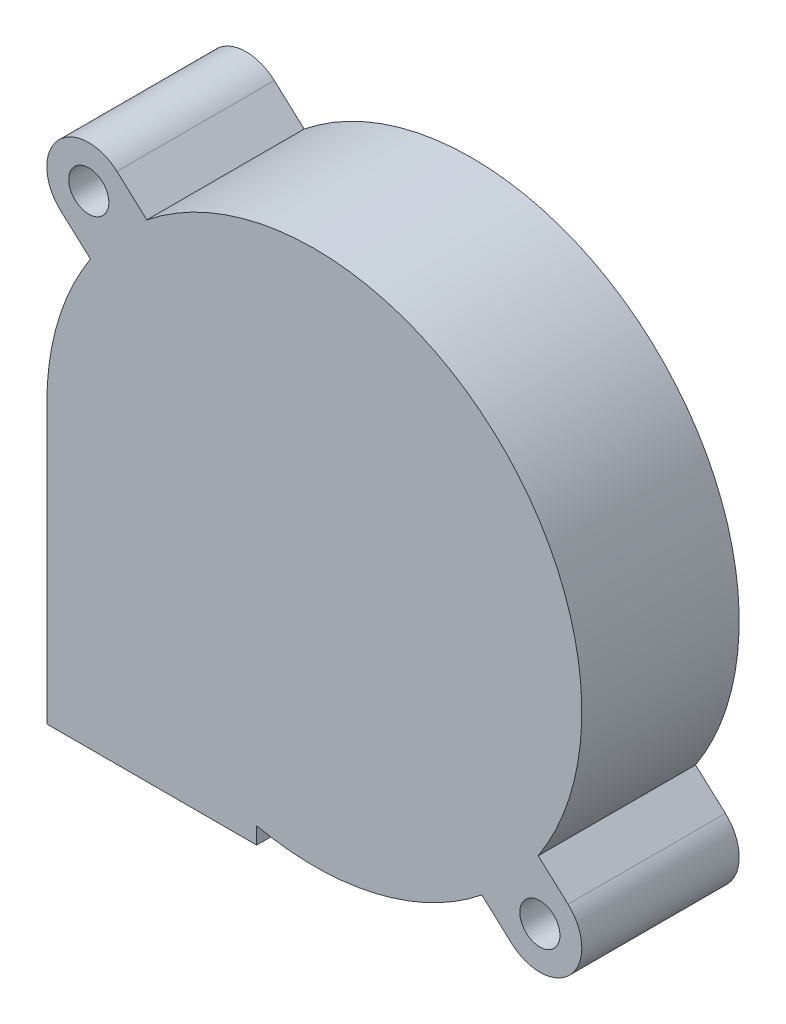
ISO-10303-21;
HEADER;
FILE_DESCRIPTION(('STEP AP214'),'2;1');
FILE_NAME('part.step','',(''),(''),'','','');
FILE_SCHEMA(('AUTOMOTIVE_DESIGN { 1 0 10303 214 1 1 1 1 }'));
ENDSEC;
DATA;
#1=APPLICATION_CONTEXT('core data for automotive mechanical design processes');
#2=APPLICATION_PROTOCOL_DEFINITION('international standard','automotive_design',2000,#1);
#3=PRODUCT_CONTEXT('',#1,'mechanical');
#4=PRODUCT('Part','Part','',(#3));
#5=PRODUCT_RELATED_PRODUCT_CATEGORY('part','',(#4));
#6=PRODUCT_DEFINITION_FORMATION('','',#4);
#7=PRODUCT_DEFINITION_CONTEXT('part definition',#1,'design');
#8=PRODUCT_DEFINITION('design','',#6,#7);
#9=PRODUCT_DEFINITION_SHAPE('','',#8);
#10=(LENGTH_UNIT() NAMED_UNIT(*) SI_UNIT(.MILLI.,.METRE.));
#11=(NAMED_UNIT(*) PLANE_ANGLE_UNIT() SI_UNIT($,.RADIAN.));
#12=(NAMED_UNIT(*) SI_UNIT($,.STERADIAN.) SOLID_ANGLE_UNIT());
#13=UNCERTAINTY_MEASURE_WITH_UNIT(LENGTH_MEASURE(1.E-05),#10,'distance_accuracy_value','');
#14=(GEOMETRIC_REPRESENTATION_CONTEXT(3) GLOBAL_UNCERTAINTY_ASSIGNED_CONTEXT((#13)) GLOBAL_UNIT_ASSIGNED_CONTEXT((#10,
#11,#12)) REPRESENTATION_CONTEXT('',''));
#15=CARTESIAN_POINT('',(0.,0.,0.));
#16=DIRECTION('',(0.,0.,1.));
#17=DIRECTION('',(1.,0.,0.));
#18=AXIS2_PLACEMENT_3D('',#15,#16,#17);
#19=CARTESIAN_POINT('',(27.3834021871777,30.1919562576574,15.));
#20=DIRECTION('',(0.671814938485816,0.740719034740771,0.));
#21=DIRECTION('',(-0.740719034740771,0.671814938485816,0.));
#22=AXIS2_PLACEMENT_3D('',#19,#20,#21);
#23=PLANE('',#22);
#24=DIRECTION('',(0.740719034740771,-0.671814938485816,0.));
#25=VECTOR('',#24,1.);
#26=CARTESIAN_POINT('',(27.3834021871777,30.1919562576574,0.));
#27=LINE('',#26,#25);
#28=CARTESIAN_POINT('',(6.68725975394327,48.9628761389631,0.));
#29=VERTEX_POINT('',#28);
#30=CARTESIAN_POINT('',(9.53275416856217,46.3820788791924,0.));
#31=VERTEX_POINT('',#30);
#32=EDGE_CURVE('E160',#29,#31,#27,.T.);
#33=ORIENTED_EDGE('',*,*,#32,.F.);
#34=DIRECTION('',(0.,0.,-1.));
#35=VECTOR('',#34,1.);
#36=CARTESIAN_POINT('',(6.68725975394327,48.9628761389631,15.));
#37=LINE('',#36,#35);
#38=CARTESIAN_POINT('',(6.68725975394327,48.9628761389631,15.));
#39=VERTEX_POINT('',#38);
#40=EDGE_CURVE('E11',#39,#29,#37,.T.);
#41=ORIENTED_EDGE('',*,*,#40,.F.);
#42=DIRECTION('',(0.740719034740771,-0.671814938485816,0.));
#43=VECTOR('',#42,1.);
#44=CARTESIAN_POINT('',(27.3834021871777,30.1919562576574,15.));
#45=LINE('',#44,#43);
#46=CARTESIAN_POINT('',(9.53275416856217,46.3820788791924,15.));
#47=VERTEX_POINT('',#46);
#48=EDGE_CURVE('E191',#39,#47,#45,.T.);
#49=ORIENTED_EDGE('',*,*,#48,.T.);
#50=DIRECTION('',(0.,0.,-1.));
#51=VECTOR('',#50,1.);
#52=CARTESIAN_POINT('',(9.53275416856217,46.3820788791924,15.));
#53=LINE('',#52,#51);
#54=EDGE_CURVE('E97',#47,#31,#53,.T.);
#55=ORIENTED_EDGE('',*,*,#54,.T.);
#56=EDGE_LOOP('',(#33,#41,#49,#55));
#57=FACE_BOUND('',#56,.T.);
#58=ADVANCED_FACE('F35',(#57),#23,.T.);
#59=CARTESIAN_POINT('',(4.,46.,15.));
#60=DIRECTION('',(0.,0.,-1.));
#61=DIRECTION('',(-1.,0.,0.));
#62=AXIS2_PLACEMENT_3D('',#59,#60,#61);
#63=CYLINDRICAL_SURFACE('',#62,4.);
#64=CARTESIAN_POINT('',(4.,46.,0.));
#65=DIRECTION('',(0.,0.,1.));
#66=DIRECTION('',(1.,0.,0.));
#67=AXIS2_PLACEMENT_3D('',#64,#65,#66);
#68=CIRCLE('',#67,4.);
#69=CARTESIAN_POINT('',(1.31274024605674,43.0371238610369,0.));
#70=VERTEX_POINT('',#69);
#71=EDGE_CURVE('E163',#29,#70,#68,.T.);
#72=ORIENTED_EDGE('',*,*,#71,.T.);
#73=DIRECTION('',(0.,0.,-1.));
#74=VECTOR('',#73,1.);
#75=CARTESIAN_POINT('',(1.31274024605674,43.0371238610369,15.));
#76=LINE('',#75,#74);
#77=CARTESIAN_POINT('',(1.31274024605674,43.0371238610369,15.));
#78=VERTEX_POINT('',#77);
#79=EDGE_CURVE('E43',#78,#70,#76,.T.);
#80=ORIENTED_EDGE('',*,*,#79,.F.);
#81=CARTESIAN_POINT('',(4.,46.,15.));
#82=DIRECTION('',(0.,0.,1.));
#83=DIRECTION('',(1.,0.,0.));
#84=AXIS2_PLACEMENT_3D('',#81,#82,#83);
#85=CIRCLE('',#84,4.);
#86=EDGE_CURVE('E238',#39,#78,#85,.T.);
#87=ORIENTED_EDGE('',*,*,#86,.F.);
#88=ORIENTED_EDGE('',*,*,#40,.T.);
#89=EDGE_LOOP('',(#72,#80,#87,#88));
#90=FACE_BOUND('',#89,.T.);
#91=ADVANCED_FACE('F263',(#90),#63,.T.);
#92=CARTESIAN_POINT('',(22.0088826792912,24.2662039797313,15.));
#93=DIRECTION('',(0.671814938485816,0.740719034740771,0.));
#94=DIRECTION('',(-0.740719034740771,0.671814938485816,0.));
#95=AXIS2_PLACEMENT_3D('',#92,#93,#94);
#96=PLANE('',#95);
#97=DIRECTION('',(0.740719034740771,-0.671814938485816,0.));
#98=VECTOR('',#97,1.);
#99=CARTESIAN_POINT('',(22.0088826792912,24.2662039797313,0.));
#100=LINE('',#99,#98);
#101=CARTESIAN_POINT('',(4.15823466067565,40.4563266012663,0.));
#102=VERTEX_POINT('',#101);
#103=EDGE_CURVE('E165',#70,#102,#100,.T.);
#104=ORIENTED_EDGE('',*,*,#103,.T.);
#105=DIRECTION('',(0.,0.,-1.));
#106=VECTOR('',#105,1.);
#107=CARTESIAN_POINT('',(4.15823466067565,40.4563266012663,15.));
#108=LINE('',#107,#106);
#109=CARTESIAN_POINT('',(4.15823466067565,40.4563266012663,15.));
#110=VERTEX_POINT('',#109);
#111=EDGE_CURVE('E208',#110,#102,#108,.T.);
#112=ORIENTED_EDGE('',*,*,#111,.F.);
#113=DIRECTION('',(0.740719034740771,-0.671814938485816,0.));
#114=VECTOR('',#113,1.);
#115=CARTESIAN_POINT('',(22.0088826792912,24.2662039797313,15.));
#116=LINE('',#115,#114);
#117=EDGE_CURVE('E217',#78,#110,#116,.T.);
#118=ORIENTED_EDGE('',*,*,#117,.F.);
#119=ORIENTED_EDGE('',*,*,#79,.T.);
#120=EDGE_LOOP('',(#104,#112,#118,#119));
#121=FACE_BOUND('',#120,.T.);
#122=ADVANCED_FACE('F215',(#121),#96,.F.);
#123=CARTESIAN_POINT('',(25.5,26.5,15.));
#124=DIRECTION('',(0.,0.,-1.));
#125=DIRECTION('',(-1.,0.,0.));
#126=AXIS2_PLACEMENT_3D('',#123,#124,#125);
#127=CYLINDRICAL_SURFACE('',#126,25.5);
#128=CARTESIAN_POINT('',(25.5,26.5,0.));
#129=DIRECTION('',(0.,0.,1.));
#130=DIRECTION('',(1.,0.,0.));
#131=AXIS2_PLACEMENT_3D('',#128,#129,#130);
#132=CIRCLE('',#131,25.5);
#133=CARTESIAN_POINT('',(0.,26.5,0.));
#134=VERTEX_POINT('',#133);
#135=EDGE_CURVE('E167',#102,#134,#132,.T.);
#136=ORIENTED_EDGE('',*,*,#135,.T.);
#137=DIRECTION('',(0.,0.,-1.));
#138=VECTOR('',#137,1.);
#139=CARTESIAN_POINT('',(0.,26.5,15.));
#140=LINE('',#139,#138);
#141=CARTESIAN_POINT('',(0.,26.5,15.));
#142=VERTEX_POINT('',#141);
#143=EDGE_CURVE('E206',#142,#134,#140,.T.);
#144=ORIENTED_EDGE('',*,*,#143,.F.);
#145=CARTESIAN_POINT('',(25.5,26.5,15.));
#146=DIRECTION('',(0.,0.,1.));
#147=DIRECTION('',(1.,0.,0.));
#148=AXIS2_PLACEMENT_3D('',#145,#146,#147);
#149=CIRCLE('',#148,25.5);
#150=EDGE_CURVE('E231',#110,#142,#149,.T.);
#151=ORIENTED_EDGE('',*,*,#150,.F.);
#152=ORIENTED_EDGE('',*,*,#111,.T.);
#153=EDGE_LOOP('',(#136,#144,#151,#152));
#154=FACE_BOUND('',#153,.T.);
#155=ADVANCED_FACE('F228',(#154),#127,.T.);
#156=CARTESIAN_POINT('',(0.,0.,15.));
#157=DIRECTION('',(-1.,0.,0.));
#158=DIRECTION('',(0.,0.,1.));
#159=AXIS2_PLACEMENT_3D('',#156,#157,#158);
#160=PLANE('',#159);
#161=DIRECTION('',(0.,1.,0.));
#162=VECTOR('',#161,1.);
#163=CARTESIAN_POINT('',(0.,0.,0.));
#164=LINE('',#163,#162);
#165=CARTESIAN_POINT('',(0.,0.,0.));
#166=VERTEX_POINT('',#165);
#167=EDGE_CURVE('E170',#166,#134,#164,.T.);
#168=ORIENTED_EDGE('',*,*,#167,.F.);
#169=DIRECTION('',(0.,0.,-1.));
#170=VECTOR('',#169,1.);
#171=CARTESIAN_POINT('',(0.,0.,15.));
#172=LINE('',#171,#170);
#173=CARTESIAN_POINT('',(0.,0.,15.));
#174=VERTEX_POINT('',#173);
#175=EDGE_CURVE('E204',#174,#166,#172,.T.);
#176=ORIENTED_EDGE('',*,*,#175,.F.);
#177=DIRECTION('',(0.,1.,0.));
#178=VECTOR('',#177,1.);
#179=CARTESIAN_POINT('',(0.,0.,15.));
#180=LINE('',#179,#178);
#181=EDGE_CURVE('E233',#174,#142,#180,.T.);
#182=ORIENTED_EDGE('',*,*,#181,.T.);
#183=ORIENTED_EDGE('',*,*,#143,.T.);
#184=EDGE_LOOP('',(#168,#176,#182,#183));
#185=FACE_BOUND('',#184,.T.);
#186=ADVANCED_FACE('F271',(#185),#160,.T.);
#187=CARTESIAN_POINT('',(0.,0.,15.));
#188=DIRECTION('',(0.,1.,0.));
#189=DIRECTION('',(0.,0.,1.));
#190=AXIS2_PLACEMENT_3D('',#187,#188,#189);
#191=PLANE('',#190);
#192=DIRECTION('',(1.,0.,0.));
#193=VECTOR('',#192,1.);
#194=CARTESIAN_POINT('',(0.,0.,0.));
#195=LINE('',#194,#193);
#196=CARTESIAN_POINT('',(20.,0.,0.));
#197=VERTEX_POINT('',#196);
#198=EDGE_CURVE('E174',#166,#197,#195,.T.);
#199=ORIENTED_EDGE('',*,*,#198,.T.);
#200=DIRECTION('',(0.,0.,-1.));
#201=VECTOR('',#200,1.);
#202=CARTESIAN_POINT('',(20.,0.,15.));
#203=LINE('',#202,#201);
#204=CARTESIAN_POINT('',(20.,0.,15.));
#205=VERTEX_POINT('',#204);
#206=EDGE_CURVE('E201',#205,#197,#203,.T.);
#207=ORIENTED_EDGE('',*,*,#206,.F.);
#208=DIRECTION('',(1.,0.,0.));
#209=VECTOR('',#208,1.);
#210=CARTESIAN_POINT('',(0.,0.,15.));
#211=LINE('',#210,#209);
#212=EDGE_CURVE('E236',#174,#205,#211,.T.);
#213=ORIENTED_EDGE('',*,*,#212,.F.);
#214=ORIENTED_EDGE('',*,*,#175,.T.);
#215=EDGE_LOOP('',(#199,#207,#213,#214));
#216=FACE_BOUND('',#215,.T.);
#217=ADVANCED_FACE('F250',(#216),#191,.F.);
#218=CARTESIAN_POINT('',(20.,0.,15.));
#219=DIRECTION('',(-1.,0.,0.));
#220=DIRECTION('',(0.,0.,1.));
#221=AXIS2_PLACEMENT_3D('',#218,#219,#220);
#222=PLANE('',#221);
#223=DIRECTION('',(0.,1.,0.));
#224=VECTOR('',#223,1.);
#225=CARTESIAN_POINT('',(20.,0.,0.));
#226=LINE('',#225,#224);
#227=CARTESIAN_POINT('',(20.,1.60020080402254,0.));
#228=VERTEX_POINT('',#227);
#229=EDGE_CURVE('E176',#197,#228,#226,.T.);
#230=ORIENTED_EDGE('',*,*,#229,.T.);
#231=DIRECTION('',(0.,0.,-1.));
#232=VECTOR('',#231,1.);
#233=CARTESIAN_POINT('',(20.,1.60020080402254,15.));
#234=LINE('',#233,#232);
#235=CARTESIAN_POINT('',(20.,1.60020080402254,15.));
#236=VERTEX_POINT('',#235);
#237=EDGE_CURVE('E198',#236,#228,#234,.T.);
#238=ORIENTED_EDGE('',*,*,#237,.F.);
#239=DIRECTION('',(0.,1.,0.));
#240=VECTOR('',#239,1.);
#241=CARTESIAN_POINT('',(20.,0.,15.));
#242=LINE('',#241,#240);
#243=EDGE_CURVE('E240',#205,#236,#242,.T.);
#244=ORIENTED_EDGE('',*,*,#243,.F.);
#245=ORIENTED_EDGE('',*,*,#206,.T.);
#246=EDGE_LOOP('',(#230,#238,#244,#245));
#247=FACE_BOUND('',#246,.T.);
#248=ADVANCED_FACE('F253',(#247),#222,.F.);
#249=CARTESIAN_POINT('',(41.4672458314378,6.61792112080755,0.));
#250=VERTEX_POINT('',#249);
#251=EDGE_CURVE('E171',#228,#250,#132,.T.);
#252=ORIENTED_EDGE('',*,*,#251,.T.);
#253=DIRECTION('',(0.,0.,-1.));
#254=VECTOR('',#253,1.);
#255=CARTESIAN_POINT('',(41.4672458314378,6.61792112080755,15.));
#256=LINE('',#255,#254);
#257=CARTESIAN_POINT('',(41.4672458314378,6.61792112080755,15.));
#258=VERTEX_POINT('',#257);
#259=EDGE_CURVE('E195',#258,#250,#256,.T.);
#260=ORIENTED_EDGE('',*,*,#259,.F.);
#261=EDGE_CURVE('E235',#236,#258,#149,.T.);
#262=ORIENTED_EDGE('',*,*,#261,.F.);
#263=ORIENTED_EDGE('',*,*,#237,.T.);
#264=EDGE_LOOP('',(#252,#260,#262,#263));
#265=FACE_BOUND('',#264,.T.);
#266=ADVANCED_FACE('F256',(#265),#127,.T.);
#267=CARTESIAN_POINT('',(22.0088826792912,24.2662039797313,15.));
#268=DIRECTION('',(0.671814938485816,0.740719034740771,0.));
#269=DIRECTION('',(-0.740719034740771,0.671814938485816,0.));
#270=AXIS2_PLACEMENT_3D('',#267,#268,#269);
#271=PLANE('',#270);
#272=DIRECTION('',(0.740719034740771,-0.671814938485816,0.));
#273=VECTOR('',#272,1.);
#274=CARTESIAN_POINT('',(22.0088826792912,24.2662039797313,0.));
#275=LINE('',#274,#273);
#276=CARTESIAN_POINT('',(44.3127402460567,4.03712386103691,0.));
#277=VERTEX_POINT('',#276);
#278=EDGE_CURVE('E178',#250,#277,#275,.T.);
#279=ORIENTED_EDGE('',*,*,#278,.T.);
#280=DIRECTION('',(0.,0.,-1.));
#281=VECTOR('',#280,1.);
#282=CARTESIAN_POINT('',(44.3127402460567,4.03712386103691,15.));
#283=LINE('',#282,#281);
#284=CARTESIAN_POINT('',(44.3127402460567,4.03712386103691,15.));
#285=VERTEX_POINT('',#284);
#286=EDGE_CURVE('E147',#285,#277,#283,.T.);
#287=ORIENTED_EDGE('',*,*,#286,.F.);
#288=DIRECTION('',(0.740719034740771,-0.671814938485816,0.));
#289=VECTOR('',#288,1.);
#290=CARTESIAN_POINT('',(22.0088826792912,24.2662039797313,15.));
#291=LINE('',#290,#289);
#292=EDGE_CURVE('E134',#258,#285,#291,.T.);
#293=ORIENTED_EDGE('',*,*,#292,.F.);
#294=ORIENTED_EDGE('',*,*,#259,.T.);
#295=EDGE_LOOP('',(#279,#287,#293,#294));
#296=FACE_BOUND('',#295,.T.);
#297=ADVANCED_FACE('F259',(#296),#271,.F.);
#298=CARTESIAN_POINT('',(47.,7.,15.));
#299=DIRECTION('',(0.,0.,-1.));
#300=DIRECTION('',(-1.,0.,0.));
#301=AXIS2_PLACEMENT_3D('',#298,#299,#300);
#302=CYLINDRICAL_SURFACE('',#301,4.00000000000001);
#303=CARTESIAN_POINT('',(47.,7.,0.));
#304=DIRECTION('',(0.,0.,1.));
#305=DIRECTION('',(1.,0.,0.));
#306=AXIS2_PLACEMENT_3D('',#303,#304,#305);
#307=CIRCLE('',#306,4.00000000000001);
#308=CARTESIAN_POINT('',(49.6872597539433,9.96287613896308,0.));
#309=VERTEX_POINT('',#308);
#310=EDGE_CURVE('E143',#277,#309,#307,.T.);
#311=ORIENTED_EDGE('',*,*,#310,.T.);
#312=DIRECTION('',(0.,0.,-1.));
#313=VECTOR('',#312,1.);
#314=CARTESIAN_POINT('',(49.6872597539433,9.96287613896308,15.));
#315=LINE('',#314,#313);
#316=CARTESIAN_POINT('',(49.6872597539433,9.96287613896308,15.));
#317=VERTEX_POINT('',#316);
#318=EDGE_CURVE('E140',#317,#309,#315,.T.);
#319=ORIENTED_EDGE('',*,*,#318,.F.);
#320=CARTESIAN_POINT('',(47.,7.,15.));
#321=DIRECTION('',(0.,0.,1.));
#322=DIRECTION('',(1.,0.,0.));
#323=AXIS2_PLACEMENT_3D('',#320,#321,#322);
#324=CIRCLE('',#323,4.00000000000001);
#325=EDGE_CURVE('E127',#285,#317,#324,.T.);
#326=ORIENTED_EDGE('',*,*,#325,.F.);
#327=ORIENTED_EDGE('',*,*,#286,.T.);
#328=EDGE_LOOP('',(#311,#319,#326,#327));
#329=FACE_BOUND('',#328,.T.);
#330=ADVANCED_FACE('F141',(#329),#302,.T.);
#331=CARTESIAN_POINT('',(27.3834021871777,30.1919562576574,15.));
#332=DIRECTION('',(0.671814938485816,0.740719034740771,0.));
#333=DIRECTION('',(-0.740719034740771,0.671814938485816,0.));
#334=AXIS2_PLACEMENT_3D('',#331,#332,#333);
#335=PLANE('',#334);
#336=DIRECTION('',(0.740719034740771,-0.671814938485816,0.));
#337=VECTOR('',#336,1.);
#338=CARTESIAN_POINT('',(27.3834021871777,30.1919562576574,0.));
#339=LINE('',#338,#337);
#340=CARTESIAN_POINT('',(46.8417653393244,12.5436733987337,0.));
#341=VERTEX_POINT('',#340);
#342=EDGE_CURVE('E181',#341,#309,#339,.T.);
#343=ORIENTED_EDGE('',*,*,#342,.F.);
#344=DIRECTION('',(0.,0.,-1.));
#345=VECTOR('',#344,1.);
#346=CARTESIAN_POINT('',(46.8417653393244,12.5436733987337,15.));
#347=LINE('',#346,#345);
#348=CARTESIAN_POINT('',(46.8417653393244,12.5436733987337,15.));
#349=VERTEX_POINT('',#348);
#350=EDGE_CURVE('E90',#349,#341,#347,.T.);
#351=ORIENTED_EDGE('',*,*,#350,.F.);
#352=DIRECTION('',(0.740719034740771,-0.671814938485816,0.));
#353=VECTOR('',#352,1.);
#354=CARTESIAN_POINT('',(27.3834021871777,30.1919562576574,15.));
#355=LINE('',#354,#353);
#356=EDGE_CURVE('E132',#349,#317,#355,.T.);
#357=ORIENTED_EDGE('',*,*,#356,.T.);
#358=ORIENTED_EDGE('',*,*,#318,.T.);
#359=EDGE_LOOP('',(#343,#351,#357,#358));
#360=FACE_BOUND('',#359,.T.);
#361=ADVANCED_FACE('F149',(#360),#335,.T.);
#362=CARTESIAN_POINT('',(47.,7.,15.));
#363=DIRECTION('',(0.,0.,-1.));
#364=DIRECTION('',(-1.,0.,0.));
#365=AXIS2_PLACEMENT_3D('',#362,#363,#364);
#366=CYLINDRICAL_SURFACE('',#365,1.91282312186486);
#367=CARTESIAN_POINT('',(47.,7.,15.));
#368=DIRECTION('',(0.,0.,1.));
#369=DIRECTION('',(1.,0.,0.));
#370=AXIS2_PLACEMENT_3D('',#367,#368,#369);
#371=CIRCLE('',#370,1.91282312186486);
#372=CARTESIAN_POINT('',(48.9128231218649,7.,15.));
#373=VERTEX_POINT('',#372);
#374=EDGE_CURVE('E151',#373,#373,#371,.T.);
#375=ORIENTED_EDGE('',*,*,#374,.T.);
#376=EDGE_LOOP('',(#375));
#377=FACE_BOUND('',#376,.T.);
#378=CARTESIAN_POINT('',(47.,7.,0.));
#379=DIRECTION('',(0.,0.,1.));
#380=DIRECTION('',(1.,0.,0.));
#381=AXIS2_PLACEMENT_3D('',#378,#379,#380);
#382=CIRCLE('',#381,1.91282312186486);
#383=CARTESIAN_POINT('',(48.9128231218649,7.,0.));
#384=VERTEX_POINT('',#383);
#385=EDGE_CURVE('E185',#384,#384,#382,.T.);
#386=ORIENTED_EDGE('',*,*,#385,.F.);
#387=EDGE_LOOP('',(#386));
#388=FACE_BOUND('',#387,.T.);
#389=ADVANCED_FACE('F287',(#377,#388),#366,.F.);
#390=CARTESIAN_POINT('',(25.5,26.5,15.));
#391=DIRECTION('',(0.,0.,-1.));
#392=DIRECTION('',(-1.,0.,0.));
#393=AXIS2_PLACEMENT_3D('',#390,#391,#392);
#394=CYLINDRICAL_SURFACE('',#393,25.5);
#395=CARTESIAN_POINT('',(25.5,26.5,0.));
#396=DIRECTION('',(0.,0.,1.));
#397=DIRECTION('',(1.,0.,0.));
#398=AXIS2_PLACEMENT_3D('',#395,#396,#397);
#399=CIRCLE('',#398,25.5);
#400=EDGE_CURVE('E183',#341,#31,#399,.T.);
#401=ORIENTED_EDGE('',*,*,#400,.T.);
#402=ORIENTED_EDGE('',*,*,#54,.F.);
#403=CARTESIAN_POINT('',(25.5,26.5,15.));
#404=DIRECTION('',(0.,0.,1.));
#405=DIRECTION('',(1.,0.,0.));
#406=AXIS2_PLACEMENT_3D('',#403,#404,#405);
#407=CIRCLE('',#406,25.5);
#408=EDGE_CURVE('E51',#349,#47,#407,.T.);
#409=ORIENTED_EDGE('',*,*,#408,.F.);
#410=ORIENTED_EDGE('',*,*,#350,.T.);
#411=EDGE_LOOP('',(#401,#402,#409,#410));
#412=FACE_BOUND('',#411,.T.);
#413=ADVANCED_FACE('F260',(#412),#394,.T.);
#414=CARTESIAN_POINT('',(4.,46.,15.));
#415=DIRECTION('',(0.,0.,-1.));
#416=DIRECTION('',(-1.,0.,0.));
#417=AXIS2_PLACEMENT_3D('',#414,#415,#416);
#418=CYLINDRICAL_SURFACE('',#417,1.91282312186485);
#419=CARTESIAN_POINT('',(4.,46.,15.));
#420=DIRECTION('',(0.,0.,1.));
#421=DIRECTION('',(1.,0.,0.));
#422=AXIS2_PLACEMENT_3D('',#419,#420,#421);
#423=CIRCLE('',#422,1.91282312186485);
#424=CARTESIAN_POINT('',(5.91282312186485,46.,15.));
#425=VERTEX_POINT('',#424);
#426=EDGE_CURVE('E157',#425,#425,#423,.T.);
#427=ORIENTED_EDGE('',*,*,#426,.T.);
#428=EDGE_LOOP('',(#427));
#429=FACE_BOUND('',#428,.T.);
#430=CARTESIAN_POINT('',(4.,46.,0.));
#431=DIRECTION('',(0.,0.,1.));
#432=DIRECTION('',(1.,0.,0.));
#433=AXIS2_PLACEMENT_3D('',#430,#431,#432);
#434=CIRCLE('',#433,1.91282312186485);
#435=CARTESIAN_POINT('',(5.91282312186485,46.,0.));
#436=VERTEX_POINT('',#435);
#437=EDGE_CURVE('E188',#436,#436,#434,.T.);
#438=ORIENTED_EDGE('',*,*,#437,.F.);
#439=EDGE_LOOP('',(#438));
#440=FACE_BOUND('',#439,.T.);
#441=ADVANCED_FACE('F290',(#429,#440),#418,.F.);
#442=CARTESIAN_POINT('',(0.,0.,15.));
#443=DIRECTION('',(0.,0.,1.));
#444=DIRECTION('',(1.,0.,0.));
#445=AXIS2_PLACEMENT_3D('',#442,#443,#444);
#446=PLANE('',#445);
#447=ORIENTED_EDGE('',*,*,#48,.F.);
#448=ORIENTED_EDGE('',*,*,#86,.T.);
#449=ORIENTED_EDGE('',*,*,#117,.T.);
#450=ORIENTED_EDGE('',*,*,#150,.T.);
#451=ORIENTED_EDGE('',*,*,#181,.F.);
#452=ORIENTED_EDGE('',*,*,#212,.T.);
#453=ORIENTED_EDGE('',*,*,#243,.T.);
#454=ORIENTED_EDGE('',*,*,#261,.T.);
#455=ORIENTED_EDGE('',*,*,#292,.T.);
#456=ORIENTED_EDGE('',*,*,#325,.T.);
#457=ORIENTED_EDGE('',*,*,#356,.F.);
#458=ORIENTED_EDGE('',*,*,#408,.T.);
#459=EDGE_LOOP('',(#447,#448,#449,#450,#451,#452,#453,#454,#455,#456,#457,#458));
#460=FACE_BOUND('',#459,.T.);
#461=ORIENTED_EDGE('',*,*,#374,.F.);
#462=EDGE_LOOP('',(#461));
#463=FACE_BOUND('',#462,.T.);
#464=ORIENTED_EDGE('',*,*,#426,.F.);
#465=EDGE_LOOP('',(#464));
#466=FACE_BOUND('',#465,.T.);
#467=ADVANCED_FACE('F129',(#460,#463,#466),#446,.T.);
#468=CARTESIAN_POINT('',(0.,0.,0.));
#469=DIRECTION('',(0.,0.,1.));
#470=DIRECTION('',(1.,0.,0.));
#471=AXIS2_PLACEMENT_3D('',#468,#469,#470);
#472=PLANE('',#471);
#473=ORIENTED_EDGE('',*,*,#32,.T.);
#474=ORIENTED_EDGE('',*,*,#400,.F.);
#475=ORIENTED_EDGE('',*,*,#342,.T.);
#476=ORIENTED_EDGE('',*,*,#310,.F.);
#477=ORIENTED_EDGE('',*,*,#278,.F.);
#478=ORIENTED_EDGE('',*,*,#251,.F.);
#479=ORIENTED_EDGE('',*,*,#229,.F.);
#480=ORIENTED_EDGE('',*,*,#198,.F.);
#481=ORIENTED_EDGE('',*,*,#167,.T.);
#482=ORIENTED_EDGE('',*,*,#135,.F.);
#483=ORIENTED_EDGE('',*,*,#103,.F.);
#484=ORIENTED_EDGE('',*,*,#71,.F.);
#485=EDGE_LOOP('',(#473,#474,#475,#476,#477,#478,#479,#480,#481,#482,#483,#484));
#486=FACE_BOUND('',#485,.T.);
#487=ORIENTED_EDGE('',*,*,#385,.T.);
#488=EDGE_LOOP('',(#487));
#489=FACE_BOUND('',#488,.T.);
#490=ORIENTED_EDGE('',*,*,#437,.T.);
#491=EDGE_LOOP('',(#490));
#492=FACE_BOUND('',#491,.T.);
#493=ADVANCED_FACE('F222',(#486,#489,#492),#472,.F.);
#494=CLOSED_SHELL('',(#58,#91,#122,#155,#186,#217,#248,#266,#297,#330,#361,#389,#413,#441,#467,#493));
#495=MANIFOLD_SOLID_BREP('B2',#494);
#496=ADVANCED_BREP_SHAPE_REPRESENTATION('',(#18,#495),#14);
#497=SHAPE_DEFINITION_REPRESENTATION(#9,#496);
ENDSEC;
END-ISO-10303-21;
